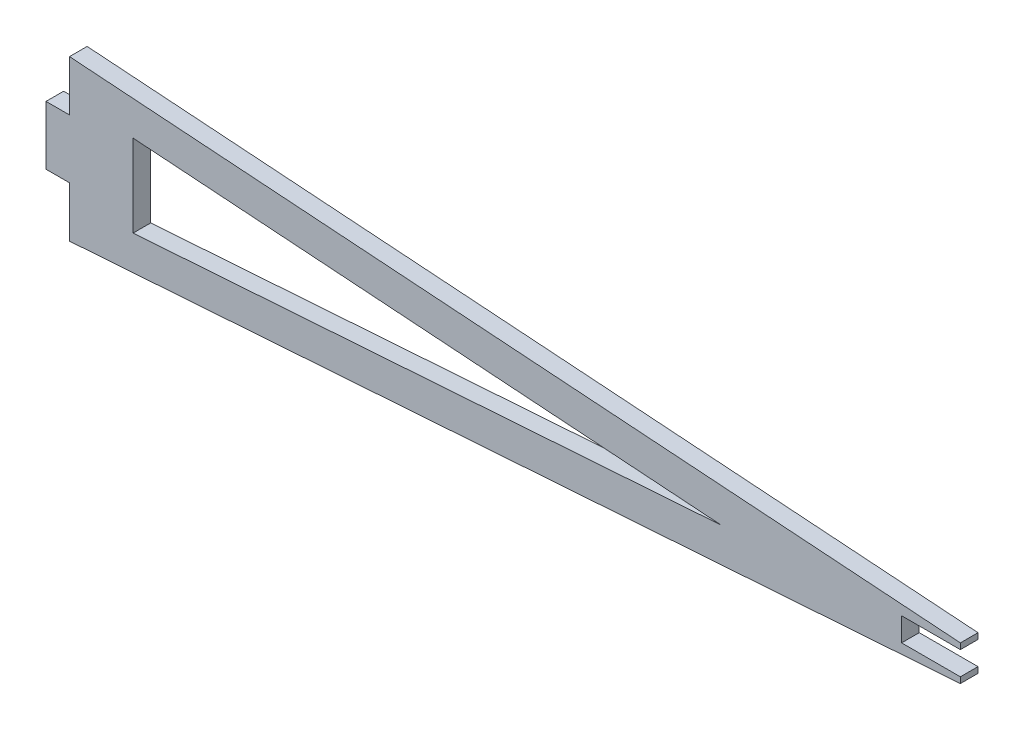
ISO-10303-21;
HEADER;
FILE_DESCRIPTION(('STEP AP214'),'2;1');
FILE_NAME('part.step','',(''),(''),'','','');
FILE_SCHEMA(('AUTOMOTIVE_DESIGN { 1 0 10303 214 1 1 1 1 }'));
ENDSEC;
DATA;
#1=APPLICATION_CONTEXT('core data for automotive mechanical design processes');
#2=APPLICATION_PROTOCOL_DEFINITION('international standard','automotive_design',2000,#1);
#3=PRODUCT_CONTEXT('',#1,'mechanical');
#4=PRODUCT('Part','Part','',(#3));
#5=PRODUCT_RELATED_PRODUCT_CATEGORY('part','',(#4));
#6=PRODUCT_DEFINITION_FORMATION('','',#4);
#7=PRODUCT_DEFINITION_CONTEXT('part definition',#1,'design');
#8=PRODUCT_DEFINITION('design','',#6,#7);
#9=PRODUCT_DEFINITION_SHAPE('','',#8);
#10=(LENGTH_UNIT() NAMED_UNIT(*) SI_UNIT(.MILLI.,.METRE.));
#11=(NAMED_UNIT(*) PLANE_ANGLE_UNIT() SI_UNIT($,.RADIAN.));
#12=(NAMED_UNIT(*) SI_UNIT($,.STERADIAN.) SOLID_ANGLE_UNIT());
#13=UNCERTAINTY_MEASURE_WITH_UNIT(LENGTH_MEASURE(1.E-05),#10,'distance_accuracy_value','');
#14=(GEOMETRIC_REPRESENTATION_CONTEXT(3) GLOBAL_UNCERTAINTY_ASSIGNED_CONTEXT((#13)) GLOBAL_UNIT_ASSIGNED_CONTEXT((#10,
#11,#12)) REPRESENTATION_CONTEXT('',''));
#15=CARTESIAN_POINT('',(0.,0.,0.));
#16=DIRECTION('',(0.,0.,1.));
#17=DIRECTION('',(1.,0.,0.));
#18=AXIS2_PLACEMENT_3D('',#15,#16,#17);
#19=CARTESIAN_POINT('',(0.,0.,15.));
#20=DIRECTION('',(0.,0.,1.));
#21=DIRECTION('',(1.,0.,0.));
#22=AXIS2_PLACEMENT_3D('',#19,#20,#21);
#23=PLANE('',#22);
#24=DIRECTION('',(0.,-1.,0.));
#25=VECTOR('',#24,1.);
#26=CARTESIAN_POINT('',(184.411857587607,170.010493646583,15.));
#27=LINE('',#26,#25);
#28=CARTESIAN_POINT('',(184.411857587607,170.010493646583,15.));
#29=VERTEX_POINT('',#28);
#30=CARTESIAN_POINT('',(184.411857587607,120.010493646583,15.));
#31=VERTEX_POINT('',#30);
#32=EDGE_CURVE('E167',#29,#31,#27,.T.);
#33=ORIENTED_EDGE('',*,*,#32,.T.);
#34=DIRECTION('',(1.,0.,0.));
#35=VECTOR('',#34,1.);
#36=CARTESIAN_POINT('',(184.411857587607,120.010493646583,15.));
#37=LINE('',#36,#35);
#38=CARTESIAN_POINT('',(204.418760095019,120.010493646583,15.));
#39=VERTEX_POINT('',#38);
#40=EDGE_CURVE('E170',#31,#39,#37,.T.);
#41=ORIENTED_EDGE('',*,*,#40,.T.);
#42=DIRECTION('',(0.,-1.,0.));
#43=VECTOR('',#42,1.);
#44=CARTESIAN_POINT('',(204.418760095019,77.0104936465812,15.));
#45=LINE('',#44,#43);
#46=CARTESIAN_POINT('',(204.418760095019,77.0104936465812,15.));
#47=VERTEX_POINT('',#46);
#48=EDGE_CURVE('E173',#39,#47,#45,.T.);
#49=ORIENTED_EDGE('',*,*,#48,.T.);
#50=DIRECTION('',(0.997564050259824,0.0697564737441267,0.));
#51=VECTOR('',#50,1.);
#52=CARTESIAN_POINT('',(204.418760095019,77.0104936465812,15.));
#53=LINE('',#52,#51);
#54=CARTESIAN_POINT('',(962.354071700762,130.010493646583,15.));
#55=VERTEX_POINT('',#54);
#56=EDGE_CURVE('E175',#47,#55,#53,.T.);
#57=ORIENTED_EDGE('',*,*,#56,.T.);
#58=DIRECTION('',(0.,1.,0.));
#59=VECTOR('',#58,1.);
#60=CARTESIAN_POINT('',(962.354071700762,130.010493646583,15.));
#61=LINE('',#60,#59);
#62=CARTESIAN_POINT('',(962.354071700762,135.010493646583,15.));
#63=VERTEX_POINT('',#62);
#64=EDGE_CURVE('E177',#55,#63,#61,.T.);
#65=ORIENTED_EDGE('',*,*,#64,.T.);
#66=DIRECTION('',(-1.,0.,0.));
#67=VECTOR('',#66,1.);
#68=CARTESIAN_POINT('',(962.354071700762,135.010493646583,15.));
#69=LINE('',#68,#67);
#70=CARTESIAN_POINT('',(912.354071700762,135.010493646583,15.));
#71=VERTEX_POINT('',#70);
#72=EDGE_CURVE('E179',#63,#71,#69,.T.);
#73=ORIENTED_EDGE('',*,*,#72,.T.);
#74=DIRECTION('',(0.,1.,0.));
#75=VECTOR('',#74,1.);
#76=CARTESIAN_POINT('',(912.354071700762,155.010493646583,15.));
#77=LINE('',#76,#75);
#78=CARTESIAN_POINT('',(912.354071700762,155.010493646583,15.));
#79=VERTEX_POINT('',#78);
#80=EDGE_CURVE('E181',#71,#79,#77,.T.);
#81=ORIENTED_EDGE('',*,*,#80,.T.);
#82=DIRECTION('',(1.,0.,0.));
#83=VECTOR('',#82,1.);
#84=CARTESIAN_POINT('',(962.354067739421,155.010493646583,15.));
#85=LINE('',#84,#83);
#86=CARTESIAN_POINT('',(962.354067739421,155.010493646583,15.));
#87=VERTEX_POINT('',#86);
#88=EDGE_CURVE('E183',#79,#87,#85,.T.);
#89=ORIENTED_EDGE('',*,*,#88,.T.);
#90=DIRECTION('',(-7.9226629701143E-07,0.999999999999686,0.));
#91=VECTOR('',#90,1.);
#92=CARTESIAN_POINT('',(962.354067739421,155.010493646583,15.));
#93=LINE('',#92,#91);
#94=CARTESIAN_POINT('',(962.35406377809,160.010493646583,15.));
#95=VERTEX_POINT('',#94);
#96=EDGE_CURVE('E185',#87,#95,#93,.T.);
#97=ORIENTED_EDGE('',*,*,#96,.T.);
#98=DIRECTION('',(-0.997564050259825,0.0697564737441116,0.));
#99=VECTOR('',#98,1.);
#100=CARTESIAN_POINT('',(204.418760095019,213.010493092566,15.));
#101=LINE('',#100,#99);
#102=CARTESIAN_POINT('',(204.418760095019,213.010493092566,15.));
#103=VERTEX_POINT('',#102);
#104=EDGE_CURVE('E187',#95,#103,#101,.T.);
#105=ORIENTED_EDGE('',*,*,#104,.T.);
#106=DIRECTION('',(-0.00016052342817973,-0.999999987116114,0.));
#107=VECTOR('',#106,1.);
#108=CARTESIAN_POINT('',(204.411857587607,170.010493646583,15.));
#109=LINE('',#108,#107);
#110=CARTESIAN_POINT('',(204.411857587607,170.010493646583,15.));
#111=VERTEX_POINT('',#110);
#112=EDGE_CURVE('E189',#103,#111,#109,.T.);
#113=ORIENTED_EDGE('',*,*,#112,.T.);
#114=DIRECTION('',(-1.,0.,0.));
#115=VECTOR('',#114,1.);
#116=CARTESIAN_POINT('',(204.411857587607,170.010493646583,15.));
#117=LINE('',#116,#115);
#118=EDGE_CURVE('E191',#111,#29,#117,.T.);
#119=ORIENTED_EDGE('',*,*,#118,.T.);
#120=EDGE_LOOP('',(#33,#41,#49,#57,#65,#73,#81,#89,#97,#105,#113,#119));
#121=FACE_BOUND('',#120,.T.);
#122=DIRECTION('',(-0.997564050259824,0.0697564737441269,0.));
#123=VECTOR('',#122,1.);
#124=CARTESIAN_POINT('',(258.506130736974,180.010493646583,15.));
#125=LINE('',#124,#123);
#126=CARTESIAN_POINT('',(759.02944972188,145.010493646583,15.));
#127=VERTEX_POINT('',#126);
#128=CARTESIAN_POINT('',(258.506130736974,180.010493646583,15.));
#129=VERTEX_POINT('',#128);
#130=EDGE_CURVE('E148',#127,#129,#125,.T.);
#131=ORIENTED_EDGE('',*,*,#130,.F.);
#132=DIRECTION('',(0.997564050259824,0.0697564737441269,0.));
#133=VECTOR('',#132,1.);
#134=CARTESIAN_POINT('',(258.506130736974,110.010493646583,15.));
#135=LINE('',#134,#133);
#136=CARTESIAN_POINT('',(258.506130736974,110.010493646583,15.));
#137=VERTEX_POINT('',#136);
#138=EDGE_CURVE('E140',#137,#127,#135,.T.);
#139=ORIENTED_EDGE('',*,*,#138,.F.);
#140=DIRECTION('',(0.,-1.,0.));
#141=VECTOR('',#140,1.);
#142=CARTESIAN_POINT('',(258.506130736974,110.010493646583,15.));
#143=LINE('',#142,#141);
#144=EDGE_CURVE('E157',#129,#137,#143,.T.);
#145=ORIENTED_EDGE('',*,*,#144,.F.);
#146=EDGE_LOOP('',(#131,#139,#145));
#147=FACE_BOUND('',#146,.T.);
#148=ADVANCED_FACE('F33',(#121,#147),#23,.T.);
#149=CARTESIAN_POINT('',(0.,0.,0.));
#150=DIRECTION('',(0.,0.,1.));
#151=DIRECTION('',(1.,0.,0.));
#152=AXIS2_PLACEMENT_3D('',#149,#150,#151);
#153=PLANE('',#152);
#154=DIRECTION('',(0.,-1.,0.));
#155=VECTOR('',#154,1.);
#156=CARTESIAN_POINT('',(184.411857587607,170.010493646583,0.));
#157=LINE('',#156,#155);
#158=CARTESIAN_POINT('',(184.411857587607,170.010493646583,0.));
#159=VERTEX_POINT('',#158);
#160=CARTESIAN_POINT('',(184.411857587607,120.010493646583,0.));
#161=VERTEX_POINT('',#160);
#162=EDGE_CURVE('E155',#159,#161,#157,.T.);
#163=ORIENTED_EDGE('',*,*,#162,.F.);
#164=DIRECTION('',(-1.,0.,0.));
#165=VECTOR('',#164,1.);
#166=CARTESIAN_POINT('',(204.411857587607,170.010493646583,0.));
#167=LINE('',#166,#165);
#168=CARTESIAN_POINT('',(204.411857587607,170.010493646583,0.));
#169=VERTEX_POINT('',#168);
#170=EDGE_CURVE('E171',#169,#159,#167,.T.);
#171=ORIENTED_EDGE('',*,*,#170,.F.);
#172=DIRECTION('',(-0.00016052342817973,-0.999999987116114,0.));
#173=VECTOR('',#172,1.);
#174=CARTESIAN_POINT('',(204.411857587607,170.010493646583,0.));
#175=LINE('',#174,#173);
#176=CARTESIAN_POINT('',(204.418760095019,213.010493092566,0.));
#177=VERTEX_POINT('',#176);
#178=EDGE_CURVE('E214',#177,#169,#175,.T.);
#179=ORIENTED_EDGE('',*,*,#178,.F.);
#180=DIRECTION('',(-0.997564050259825,0.0697564737441116,0.));
#181=VECTOR('',#180,1.);
#182=CARTESIAN_POINT('',(204.418760095019,213.010493092566,0.));
#183=LINE('',#182,#181);
#184=CARTESIAN_POINT('',(962.35406377809,160.010493646583,0.));
#185=VERTEX_POINT('',#184);
#186=EDGE_CURVE('E212',#185,#177,#183,.T.);
#187=ORIENTED_EDGE('',*,*,#186,.F.);
#188=DIRECTION('',(-7.9226629701143E-07,0.999999999999686,0.));
#189=VECTOR('',#188,1.);
#190=CARTESIAN_POINT('',(962.354067739421,155.010493646583,0.));
#191=LINE('',#190,#189);
#192=CARTESIAN_POINT('',(962.354067739421,155.010493646583,0.));
#193=VERTEX_POINT('',#192);
#194=EDGE_CURVE('E210',#193,#185,#191,.T.);
#195=ORIENTED_EDGE('',*,*,#194,.F.);
#196=DIRECTION('',(1.,0.,0.));
#197=VECTOR('',#196,1.);
#198=CARTESIAN_POINT('',(962.354067739421,155.010493646583,0.));
#199=LINE('',#198,#197);
#200=CARTESIAN_POINT('',(912.354071700762,155.010493646583,0.));
#201=VERTEX_POINT('',#200);
#202=EDGE_CURVE('E208',#201,#193,#199,.T.);
#203=ORIENTED_EDGE('',*,*,#202,.F.);
#204=DIRECTION('',(0.,1.,0.));
#205=VECTOR('',#204,1.);
#206=CARTESIAN_POINT('',(912.354071700762,155.010493646583,0.));
#207=LINE('',#206,#205);
#208=CARTESIAN_POINT('',(912.354071700762,135.010493646583,0.));
#209=VERTEX_POINT('',#208);
#210=EDGE_CURVE('E206',#209,#201,#207,.T.);
#211=ORIENTED_EDGE('',*,*,#210,.F.);
#212=DIRECTION('',(-1.,0.,0.));
#213=VECTOR('',#212,1.);
#214=CARTESIAN_POINT('',(962.354071700762,135.010493646583,0.));
#215=LINE('',#214,#213);
#216=CARTESIAN_POINT('',(962.354071700762,135.010493646583,0.));
#217=VERTEX_POINT('',#216);
#218=EDGE_CURVE('E204',#217,#209,#215,.T.);
#219=ORIENTED_EDGE('',*,*,#218,.F.);
#220=DIRECTION('',(0.,1.,0.));
#221=VECTOR('',#220,1.);
#222=CARTESIAN_POINT('',(962.354071700762,130.010493646583,0.));
#223=LINE('',#222,#221);
#224=CARTESIAN_POINT('',(962.354071700762,130.010493646583,0.));
#225=VERTEX_POINT('',#224);
#226=EDGE_CURVE('E202',#225,#217,#223,.T.);
#227=ORIENTED_EDGE('',*,*,#226,.F.);
#228=DIRECTION('',(0.997564050259824,0.0697564737441267,0.));
#229=VECTOR('',#228,1.);
#230=CARTESIAN_POINT('',(204.418760095019,77.0104936465812,0.));
#231=LINE('',#230,#229);
#232=CARTESIAN_POINT('',(204.418760095019,77.0104936465812,0.));
#233=VERTEX_POINT('',#232);
#234=EDGE_CURVE('E200',#233,#225,#231,.T.);
#235=ORIENTED_EDGE('',*,*,#234,.F.);
#236=DIRECTION('',(0.,-1.,0.));
#237=VECTOR('',#236,1.);
#238=CARTESIAN_POINT('',(204.418760095019,77.0104936465812,0.));
#239=LINE('',#238,#237);
#240=CARTESIAN_POINT('',(204.418760095019,120.010493646583,0.));
#241=VERTEX_POINT('',#240);
#242=EDGE_CURVE('E198',#241,#233,#239,.T.);
#243=ORIENTED_EDGE('',*,*,#242,.F.);
#244=DIRECTION('',(1.,0.,0.));
#245=VECTOR('',#244,1.);
#246=CARTESIAN_POINT('',(184.411857587607,120.010493646583,0.));
#247=LINE('',#246,#245);
#248=EDGE_CURVE('E196',#161,#241,#247,.T.);
#249=ORIENTED_EDGE('',*,*,#248,.F.);
#250=EDGE_LOOP('',(#163,#171,#179,#187,#195,#203,#211,#219,#227,#235,#243,#249));
#251=FACE_BOUND('',#250,.T.);
#252=DIRECTION('',(0.997564050259824,0.0697564737441269,0.));
#253=VECTOR('',#252,1.);
#254=CARTESIAN_POINT('',(258.506130736974,110.010493646583,0.));
#255=LINE('',#254,#253);
#256=CARTESIAN_POINT('',(258.506130736974,110.010493646583,0.));
#257=VERTEX_POINT('',#256);
#258=CARTESIAN_POINT('',(759.02944972188,145.010493646583,0.));
#259=VERTEX_POINT('',#258);
#260=EDGE_CURVE('E56',#257,#259,#255,.T.);
#261=ORIENTED_EDGE('',*,*,#260,.T.);
#262=DIRECTION('',(-0.997564050259824,0.0697564737441269,0.));
#263=VECTOR('',#262,1.);
#264=CARTESIAN_POINT('',(258.506130736974,180.010493646583,0.));
#265=LINE('',#264,#263);
#266=CARTESIAN_POINT('',(258.506130736974,180.010493646583,0.));
#267=VERTEX_POINT('',#266);
#268=EDGE_CURVE('E154',#259,#267,#265,.T.);
#269=ORIENTED_EDGE('',*,*,#268,.T.);
#270=DIRECTION('',(0.,-1.,0.));
#271=VECTOR('',#270,1.);
#272=CARTESIAN_POINT('',(258.506130736974,110.010493646583,0.));
#273=LINE('',#272,#271);
#274=EDGE_CURVE('E149',#267,#257,#273,.T.);
#275=ORIENTED_EDGE('',*,*,#274,.T.);
#276=EDGE_LOOP('',(#261,#269,#275));
#277=FACE_BOUND('',#276,.T.);
#278=ADVANCED_FACE('F256',(#251,#277),#153,.F.);
#279=CARTESIAN_POINT('',(184.411857587607,170.010493646583,15.));
#280=DIRECTION('',(1.,0.,0.));
#281=DIRECTION('',(0.,0.,-1.));
#282=AXIS2_PLACEMENT_3D('',#279,#280,#281);
#283=PLANE('',#282);
#284=ORIENTED_EDGE('',*,*,#162,.T.);
#285=DIRECTION('',(0.,0.,-1.));
#286=VECTOR('',#285,1.);
#287=CARTESIAN_POINT('',(184.411857587607,120.010493646583,15.));
#288=LINE('',#287,#286);
#289=EDGE_CURVE('E11',#31,#161,#288,.T.);
#290=ORIENTED_EDGE('',*,*,#289,.F.);
#291=ORIENTED_EDGE('',*,*,#32,.F.);
#292=DIRECTION('',(0.,0.,-1.));
#293=VECTOR('',#292,1.);
#294=CARTESIAN_POINT('',(184.411857587607,170.010493646583,15.));
#295=LINE('',#294,#293);
#296=EDGE_CURVE('E193',#29,#159,#295,.T.);
#297=ORIENTED_EDGE('',*,*,#296,.T.);
#298=EDGE_LOOP('',(#284,#290,#291,#297));
#299=FACE_BOUND('',#298,.T.);
#300=ADVANCED_FACE('F35',(#299),#283,.F.);
#301=CARTESIAN_POINT('',(184.411857587607,120.010493646583,15.));
#302=DIRECTION('',(0.,1.,0.));
#303=DIRECTION('',(0.,0.,1.));
#304=AXIS2_PLACEMENT_3D('',#301,#302,#303);
#305=PLANE('',#304);
#306=ORIENTED_EDGE('',*,*,#248,.T.);
#307=DIRECTION('',(0.,0.,-1.));
#308=VECTOR('',#307,1.);
#309=CARTESIAN_POINT('',(204.418760095019,120.010493646583,15.));
#310=LINE('',#309,#308);
#311=EDGE_CURVE('E41',#39,#241,#310,.T.);
#312=ORIENTED_EDGE('',*,*,#311,.F.);
#313=ORIENTED_EDGE('',*,*,#40,.F.);
#314=ORIENTED_EDGE('',*,*,#289,.T.);
#315=EDGE_LOOP('',(#306,#312,#313,#314));
#316=FACE_BOUND('',#315,.T.);
#317=ADVANCED_FACE('F273',(#316),#305,.F.);
#318=CARTESIAN_POINT('',(204.418760095019,77.0104936465812,15.));
#319=DIRECTION('',(1.,0.,0.));
#320=DIRECTION('',(0.,0.,-1.));
#321=AXIS2_PLACEMENT_3D('',#318,#319,#320);
#322=PLANE('',#321);
#323=ORIENTED_EDGE('',*,*,#242,.T.);
#324=DIRECTION('',(0.,0.,-1.));
#325=VECTOR('',#324,1.);
#326=CARTESIAN_POINT('',(204.418760095019,77.0104936465812,15.));
#327=LINE('',#326,#325);
#328=EDGE_CURVE('E243',#47,#233,#327,.T.);
#329=ORIENTED_EDGE('',*,*,#328,.F.);
#330=ORIENTED_EDGE('',*,*,#48,.F.);
#331=ORIENTED_EDGE('',*,*,#311,.T.);
#332=EDGE_LOOP('',(#323,#329,#330,#331));
#333=FACE_BOUND('',#332,.T.);
#334=ADVANCED_FACE('F250',(#333),#322,.F.);
#335=CARTESIAN_POINT('',(204.418760095019,77.0104936465812,15.));
#336=DIRECTION('',(-0.0697564737441267,0.997564050259824,0.));
#337=DIRECTION('',(-0.997564050259824,-0.0697564737441267,0.));
#338=AXIS2_PLACEMENT_3D('',#335,#336,#337);
#339=PLANE('',#338);
#340=ORIENTED_EDGE('',*,*,#234,.T.);
#341=DIRECTION('',(0.,0.,-1.));
#342=VECTOR('',#341,1.);
#343=CARTESIAN_POINT('',(962.354071700762,130.010493646583,15.));
#344=LINE('',#343,#342);
#345=EDGE_CURVE('E240',#55,#225,#344,.T.);
#346=ORIENTED_EDGE('',*,*,#345,.F.);
#347=ORIENTED_EDGE('',*,*,#56,.F.);
#348=ORIENTED_EDGE('',*,*,#328,.T.);
#349=EDGE_LOOP('',(#340,#346,#347,#348));
#350=FACE_BOUND('',#349,.T.);
#351=ADVANCED_FACE('F262',(#350),#339,.F.);
#352=CARTESIAN_POINT('',(962.354071700762,130.010493646583,15.));
#353=DIRECTION('',(-1.,0.,0.));
#354=DIRECTION('',(0.,0.,1.));
#355=AXIS2_PLACEMENT_3D('',#352,#353,#354);
#356=PLANE('',#355);
#357=ORIENTED_EDGE('',*,*,#226,.T.);
#358=DIRECTION('',(0.,0.,-1.));
#359=VECTOR('',#358,1.);
#360=CARTESIAN_POINT('',(962.354071700762,135.010493646583,15.));
#361=LINE('',#360,#359);
#362=EDGE_CURVE('E237',#63,#217,#361,.T.);
#363=ORIENTED_EDGE('',*,*,#362,.F.);
#364=ORIENTED_EDGE('',*,*,#64,.F.);
#365=ORIENTED_EDGE('',*,*,#345,.T.);
#366=EDGE_LOOP('',(#357,#363,#364,#365));
#367=FACE_BOUND('',#366,.T.);
#368=ADVANCED_FACE('F266',(#367),#356,.F.);
#369=CARTESIAN_POINT('',(962.354071700762,135.010493646583,15.));
#370=DIRECTION('',(0.,-1.,0.));
#371=DIRECTION('',(0.,0.,-1.));
#372=AXIS2_PLACEMENT_3D('',#369,#370,#371);
#373=PLANE('',#372);
#374=ORIENTED_EDGE('',*,*,#218,.T.);
#375=DIRECTION('',(0.,0.,-1.));
#376=VECTOR('',#375,1.);
#377=CARTESIAN_POINT('',(912.354071700762,135.010493646583,15.));
#378=LINE('',#377,#376);
#379=EDGE_CURVE('E234',#71,#209,#378,.T.);
#380=ORIENTED_EDGE('',*,*,#379,.F.);
#381=ORIENTED_EDGE('',*,*,#72,.F.);
#382=ORIENTED_EDGE('',*,*,#362,.T.);
#383=EDGE_LOOP('',(#374,#380,#381,#382));
#384=FACE_BOUND('',#383,.T.);
#385=ADVANCED_FACE('F306',(#384),#373,.F.);
#386=CARTESIAN_POINT('',(912.354071700762,155.010493646583,15.));
#387=DIRECTION('',(-1.,0.,0.));
#388=DIRECTION('',(0.,0.,1.));
#389=AXIS2_PLACEMENT_3D('',#386,#387,#388);
#390=PLANE('',#389);
#391=ORIENTED_EDGE('',*,*,#210,.T.);
#392=DIRECTION('',(0.,0.,-1.));
#393=VECTOR('',#392,1.);
#394=CARTESIAN_POINT('',(912.354071700762,155.010493646583,15.));
#395=LINE('',#394,#393);
#396=EDGE_CURVE('E231',#79,#201,#395,.T.);
#397=ORIENTED_EDGE('',*,*,#396,.F.);
#398=ORIENTED_EDGE('',*,*,#80,.F.);
#399=ORIENTED_EDGE('',*,*,#379,.T.);
#400=EDGE_LOOP('',(#391,#397,#398,#399));
#401=FACE_BOUND('',#400,.T.);
#402=ADVANCED_FACE('F304',(#401),#390,.F.);
#403=CARTESIAN_POINT('',(962.354067739421,155.010493646583,15.));
#404=DIRECTION('',(0.,1.,0.));
#405=DIRECTION('',(0.,0.,1.));
#406=AXIS2_PLACEMENT_3D('',#403,#404,#405);
#407=PLANE('',#406);
#408=ORIENTED_EDGE('',*,*,#202,.T.);
#409=DIRECTION('',(0.,0.,-1.));
#410=VECTOR('',#409,1.);
#411=CARTESIAN_POINT('',(962.354067739421,155.010493646583,15.));
#412=LINE('',#411,#410);
#413=EDGE_CURVE('E228',#87,#193,#412,.T.);
#414=ORIENTED_EDGE('',*,*,#413,.F.);
#415=ORIENTED_EDGE('',*,*,#88,.F.);
#416=ORIENTED_EDGE('',*,*,#396,.T.);
#417=EDGE_LOOP('',(#408,#414,#415,#416));
#418=FACE_BOUND('',#417,.T.);
#419=ADVANCED_FACE('F300',(#418),#407,.F.);
#420=CARTESIAN_POINT('',(962.354067739421,155.010493646583,15.));
#421=DIRECTION('',(-0.999999999999686,-7.9226629701143E-07,0.));
#422=DIRECTION('',(7.9226629701143E-07,-0.999999999999686,0.));
#423=AXIS2_PLACEMENT_3D('',#420,#421,#422);
#424=PLANE('',#423);
#425=ORIENTED_EDGE('',*,*,#194,.T.);
#426=DIRECTION('',(0.,0.,-1.));
#427=VECTOR('',#426,1.);
#428=CARTESIAN_POINT('',(962.35406377809,160.010493646583,15.));
#429=LINE('',#428,#427);
#430=EDGE_CURVE('E225',#95,#185,#429,.T.);
#431=ORIENTED_EDGE('',*,*,#430,.F.);
#432=ORIENTED_EDGE('',*,*,#96,.F.);
#433=ORIENTED_EDGE('',*,*,#413,.T.);
#434=EDGE_LOOP('',(#425,#431,#432,#433));
#435=FACE_BOUND('',#434,.T.);
#436=ADVANCED_FACE('F295',(#435),#424,.F.);
#437=CARTESIAN_POINT('',(204.418760095019,213.010493092566,15.));
#438=DIRECTION('',(-0.0697564737441116,-0.997564050259825,0.));
#439=DIRECTION('',(0.997564050259825,-0.0697564737441116,0.));
#440=AXIS2_PLACEMENT_3D('',#437,#438,#439);
#441=PLANE('',#440);
#442=ORIENTED_EDGE('',*,*,#186,.T.);
#443=DIRECTION('',(0.,0.,-1.));
#444=VECTOR('',#443,1.);
#445=CARTESIAN_POINT('',(204.418760095019,213.010493092566,15.));
#446=LINE('',#445,#444);
#447=EDGE_CURVE('E222',#103,#177,#446,.T.);
#448=ORIENTED_EDGE('',*,*,#447,.F.);
#449=ORIENTED_EDGE('',*,*,#104,.F.);
#450=ORIENTED_EDGE('',*,*,#430,.T.);
#451=EDGE_LOOP('',(#442,#448,#449,#450));
#452=FACE_BOUND('',#451,.T.);
#453=ADVANCED_FACE('F289',(#452),#441,.F.);
#454=CARTESIAN_POINT('',(204.411857587607,170.010493646583,15.));
#455=DIRECTION('',(0.999999987116114,-0.00016052342817973,0.));
#456=DIRECTION('',(0.00016052342817973,0.999999987116114,0.));
#457=AXIS2_PLACEMENT_3D('',#454,#455,#456);
#458=PLANE('',#457);
#459=ORIENTED_EDGE('',*,*,#178,.T.);
#460=DIRECTION('',(0.,0.,-1.));
#461=VECTOR('',#460,1.);
#462=CARTESIAN_POINT('',(204.411857587607,170.010493646583,15.));
#463=LINE('',#462,#461);
#464=EDGE_CURVE('E219',#111,#169,#463,.T.);
#465=ORIENTED_EDGE('',*,*,#464,.F.);
#466=ORIENTED_EDGE('',*,*,#112,.F.);
#467=ORIENTED_EDGE('',*,*,#447,.T.);
#468=EDGE_LOOP('',(#459,#465,#466,#467));
#469=FACE_BOUND('',#468,.T.);
#470=ADVANCED_FACE('F285',(#469),#458,.F.);
#471=CARTESIAN_POINT('',(204.411857587607,170.010493646583,15.));
#472=DIRECTION('',(0.,-1.,0.));
#473=DIRECTION('',(0.,0.,-1.));
#474=AXIS2_PLACEMENT_3D('',#471,#472,#473);
#475=PLANE('',#474);
#476=ORIENTED_EDGE('',*,*,#170,.T.);
#477=ORIENTED_EDGE('',*,*,#296,.F.);
#478=ORIENTED_EDGE('',*,*,#118,.F.);
#479=ORIENTED_EDGE('',*,*,#464,.T.);
#480=EDGE_LOOP('',(#476,#477,#478,#479));
#481=FACE_BOUND('',#480,.T.);
#482=ADVANCED_FACE('F280',(#481),#475,.F.);
#483=CARTESIAN_POINT('',(258.506130736974,110.010493646583,15.));
#484=DIRECTION('',(-0.0697564737441269,0.997564050259824,0.));
#485=DIRECTION('',(-0.997564050259824,-0.0697564737441269,0.));
#486=AXIS2_PLACEMENT_3D('',#483,#484,#485);
#487=PLANE('',#486);
#488=ORIENTED_EDGE('',*,*,#260,.F.);
#489=DIRECTION('',(0.,0.,-1.));
#490=VECTOR('',#489,1.);
#491=CARTESIAN_POINT('',(258.506130736974,110.010493646583,15.));
#492=LINE('',#491,#490);
#493=EDGE_CURVE('E144',#137,#257,#492,.T.);
#494=ORIENTED_EDGE('',*,*,#493,.F.);
#495=ORIENTED_EDGE('',*,*,#138,.T.);
#496=DIRECTION('',(0.,0.,-1.));
#497=VECTOR('',#496,1.);
#498=CARTESIAN_POINT('',(759.02944972188,145.010493646583,15.));
#499=LINE('',#498,#497);
#500=EDGE_CURVE('E143',#127,#259,#499,.T.);
#501=ORIENTED_EDGE('',*,*,#500,.T.);
#502=EDGE_LOOP('',(#488,#494,#495,#501));
#503=FACE_BOUND('',#502,.T.);
#504=ADVANCED_FACE('F142',(#503),#487,.T.);
#505=CARTESIAN_POINT('',(258.506130736974,180.010493646583,15.));
#506=DIRECTION('',(-0.0697564737441269,-0.997564050259824,0.));
#507=DIRECTION('',(0.997564050259824,-0.0697564737441269,0.));
#508=AXIS2_PLACEMENT_3D('',#505,#506,#507);
#509=PLANE('',#508);
#510=ORIENTED_EDGE('',*,*,#268,.F.);
#511=ORIENTED_EDGE('',*,*,#500,.F.);
#512=ORIENTED_EDGE('',*,*,#130,.T.);
#513=DIRECTION('',(0.,0.,-1.));
#514=VECTOR('',#513,1.);
#515=CARTESIAN_POINT('',(258.506130736974,180.010493646583,15.));
#516=LINE('',#515,#514);
#517=EDGE_CURVE('E48',#129,#267,#516,.T.);
#518=ORIENTED_EDGE('',*,*,#517,.T.);
#519=EDGE_LOOP('',(#510,#511,#512,#518));
#520=FACE_BOUND('',#519,.T.);
#521=ADVANCED_FACE('F152',(#520),#509,.T.);
#522=CARTESIAN_POINT('',(258.506130736974,110.010493646583,15.));
#523=DIRECTION('',(1.,0.,0.));
#524=DIRECTION('',(0.,0.,-1.));
#525=AXIS2_PLACEMENT_3D('',#522,#523,#524);
#526=PLANE('',#525);
#527=ORIENTED_EDGE('',*,*,#274,.F.);
#528=ORIENTED_EDGE('',*,*,#517,.F.);
#529=ORIENTED_EDGE('',*,*,#144,.T.);
#530=ORIENTED_EDGE('',*,*,#493,.T.);
#531=EDGE_LOOP('',(#527,#528,#529,#530));
#532=FACE_BOUND('',#531,.T.);
#533=ADVANCED_FACE('F364',(#532),#526,.T.);
#534=CLOSED_SHELL('',(#148,#278,#300,#317,#334,#351,#368,#385,#402,#419,#436,#453,#470,#482,
#504,#521,#533));
#535=MANIFOLD_SOLID_BREP('B2',#534);
#536=ADVANCED_BREP_SHAPE_REPRESENTATION('',(#18,#535),#14);
#537=SHAPE_DEFINITION_REPRESENTATION(#9,#536);
ENDSEC;
END-ISO-10303-21;
